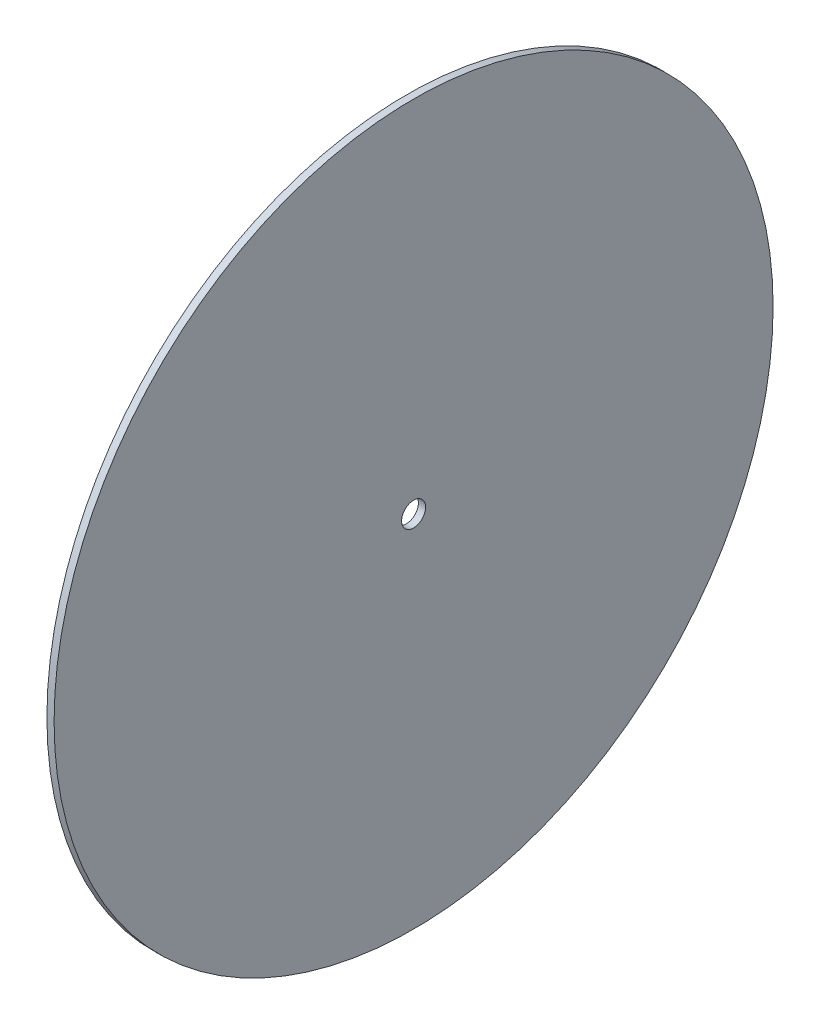
ISO-10303-21;
HEADER;
FILE_DESCRIPTION(('STEP AP214'),'2;1');
FILE_NAME('part.step','',(''),(''),'','','');
FILE_SCHEMA(('AUTOMOTIVE_DESIGN { 1 0 10303 214 1 1 1 1 }'));
ENDSEC;
DATA;
#1=APPLICATION_CONTEXT('core data for automotive mechanical design processes');
#2=APPLICATION_PROTOCOL_DEFINITION('international standard','automotive_design',2000,#1);
#3=PRODUCT_CONTEXT('',#1,'mechanical');
#4=PRODUCT('Part','Part','',(#3));
#5=PRODUCT_RELATED_PRODUCT_CATEGORY('part','',(#4));
#6=PRODUCT_DEFINITION_FORMATION('','',#4);
#7=PRODUCT_DEFINITION_CONTEXT('part definition',#1,'design');
#8=PRODUCT_DEFINITION('design','',#6,#7);
#9=PRODUCT_DEFINITION_SHAPE('','',#8);
#10=(LENGTH_UNIT() NAMED_UNIT(*) SI_UNIT(.MILLI.,.METRE.));
#11=(NAMED_UNIT(*) PLANE_ANGLE_UNIT() SI_UNIT($,.RADIAN.));
#12=(NAMED_UNIT(*) SI_UNIT($,.STERADIAN.) SOLID_ANGLE_UNIT());
#13=UNCERTAINTY_MEASURE_WITH_UNIT(LENGTH_MEASURE(1.E-05),#10,'distance_accuracy_value','');
#14=(GEOMETRIC_REPRESENTATION_CONTEXT(3) GLOBAL_UNCERTAINTY_ASSIGNED_CONTEXT((#13)) GLOBAL_UNIT_ASSIGNED_CONTEXT((#10,
#11,#12)) REPRESENTATION_CONTEXT('',''));
#15=CARTESIAN_POINT('',(0.,0.,0.));
#16=DIRECTION('',(0.,0.,1.));
#17=DIRECTION('',(1.,0.,0.));
#18=AXIS2_PLACEMENT_3D('',#15,#16,#17);
#19=CARTESIAN_POINT('',(0.,0.,150.));
#20=DIRECTION('',(-1.,0.,0.));
#21=DIRECTION('',(0.,0.,1.));
#22=AXIS2_PLACEMENT_3D('',#19,#20,#21);
#23=PLANE('',#22);
#24=CARTESIAN_POINT('',(0.,0.,0.));
#25=DIRECTION('',(-1.,0.,0.));
#26=DIRECTION('',(0.,0.,1.));
#27=AXIS2_PLACEMENT_3D('',#24,#25,#26);
#28=CIRCLE('',#27,150.);
#29=CARTESIAN_POINT('',(0.,0.,150.));
#30=VERTEX_POINT('',#29);
#31=EDGE_CURVE('E44',#30,#30,#28,.T.);
#32=ORIENTED_EDGE('',*,*,#31,.T.);
#33=EDGE_LOOP('',(#32));
#34=FACE_BOUND('',#33,.T.);
#35=CARTESIAN_POINT('',(0.,0.,0.));
#36=DIRECTION('',(-1.,0.,0.));
#37=DIRECTION('',(0.,0.,1.));
#38=AXIS2_PLACEMENT_3D('',#35,#36,#37);
#39=CIRCLE('',#38,5.);
#40=CARTESIAN_POINT('',(0.,0.,5.));
#41=VERTEX_POINT('',#40);
#42=EDGE_CURVE('E10',#41,#41,#39,.T.);
#43=ORIENTED_EDGE('',*,*,#42,.F.);
#44=EDGE_LOOP('',(#43));
#45=FACE_BOUND('',#44,.T.);
#46=ADVANCED_FACE('F30',(#34,#45),#23,.T.);
#47=CARTESIAN_POINT('',(0.,0.,0.));
#48=DIRECTION('',(-1.,0.,0.));
#49=DIRECTION('',(0.,0.,1.));
#50=AXIS2_PLACEMENT_3D('',#47,#48,#49);
#51=CYLINDRICAL_SURFACE('',#50,5.);
#52=ORIENTED_EDGE('',*,*,#42,.T.);
#53=EDGE_LOOP('',(#52));
#54=FACE_BOUND('',#53,.T.);
#55=CARTESIAN_POINT('',(3.,0.,0.));
#56=DIRECTION('',(-1.,0.,0.));
#57=DIRECTION('',(0.,0.,1.));
#58=AXIS2_PLACEMENT_3D('',#55,#56,#57);
#59=CIRCLE('',#58,5.);
#60=CARTESIAN_POINT('',(3.,0.,5.));
#61=VERTEX_POINT('',#60);
#62=EDGE_CURVE('E36',#61,#61,#59,.T.);
#63=ORIENTED_EDGE('',*,*,#62,.F.);
#64=EDGE_LOOP('',(#63));
#65=FACE_BOUND('',#64,.T.);
#66=ADVANCED_FACE('F60',(#54,#65),#51,.F.);
#67=CARTESIAN_POINT('',(3.,0.,150.));
#68=DIRECTION('',(1.,0.,0.));
#69=DIRECTION('',(0.,0.,-1.));
#70=AXIS2_PLACEMENT_3D('',#67,#68,#69);
#71=PLANE('',#70);
#72=ORIENTED_EDGE('',*,*,#62,.T.);
#73=EDGE_LOOP('',(#72));
#74=FACE_BOUND('',#73,.T.);
#75=CARTESIAN_POINT('',(3.,0.,0.));
#76=DIRECTION('',(-1.,0.,0.));
#77=DIRECTION('',(0.,0.,1.));
#78=AXIS2_PLACEMENT_3D('',#75,#76,#77);
#79=CIRCLE('',#78,150.);
#80=CARTESIAN_POINT('',(3.,0.,150.));
#81=VERTEX_POINT('',#80);
#82=EDGE_CURVE('E40',#81,#81,#79,.T.);
#83=ORIENTED_EDGE('',*,*,#82,.F.);
#84=EDGE_LOOP('',(#83));
#85=FACE_BOUND('',#84,.T.);
#86=ADVANCED_FACE('F54',(#74,#85),#71,.T.);
#87=CARTESIAN_POINT('',(0.,0.,0.));
#88=DIRECTION('',(-1.,0.,0.));
#89=DIRECTION('',(0.,0.,1.));
#90=AXIS2_PLACEMENT_3D('',#87,#88,#89);
#91=CYLINDRICAL_SURFACE('',#90,150.);
#92=ORIENTED_EDGE('',*,*,#82,.T.);
#93=EDGE_LOOP('',(#92));
#94=FACE_BOUND('',#93,.T.);
#95=ORIENTED_EDGE('',*,*,#31,.F.);
#96=EDGE_LOOP('',(#95));
#97=FACE_BOUND('',#96,.T.);
#98=ADVANCED_FACE('F52',(#94,#97),#91,.T.);
#99=CLOSED_SHELL('',(#46,#66,#86,#98));
#100=MANIFOLD_SOLID_BREP('B2',#99);
#101=ADVANCED_BREP_SHAPE_REPRESENTATION('',(#18,#100),#14);
#102=SHAPE_DEFINITION_REPRESENTATION(#9,#101);
ENDSEC;
END-ISO-10303-21;
